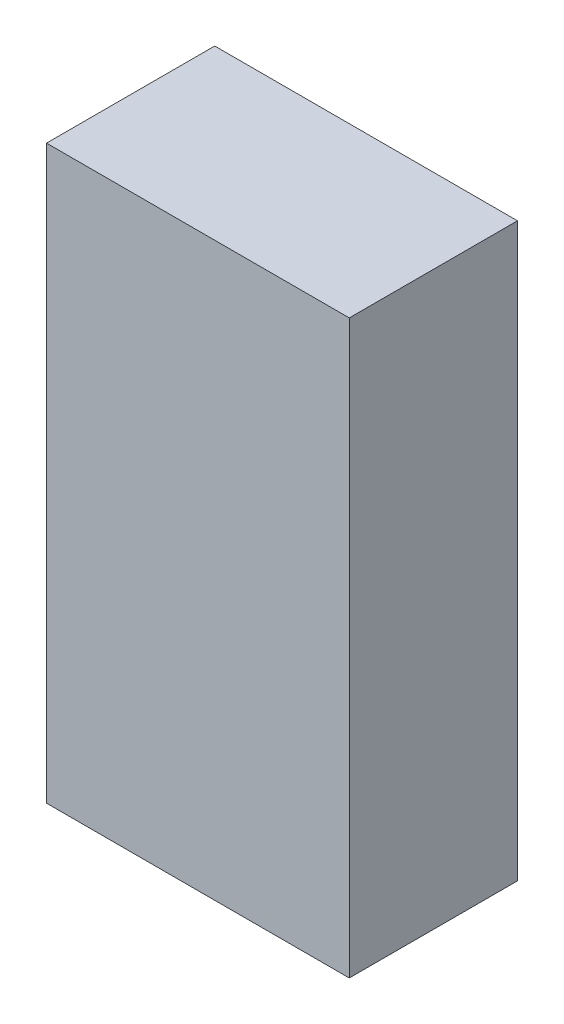
ISO-10303-21;
HEADER;
FILE_DESCRIPTION(('STEP AP214'),'2;1');
FILE_NAME('part.step','',(''),(''),'','','');
FILE_SCHEMA(('AUTOMOTIVE_DESIGN { 1 0 10303 214 1 1 1 1 }'));
ENDSEC;
DATA;
#1=APPLICATION_CONTEXT('core data for automotive mechanical design processes');
#2=APPLICATION_PROTOCOL_DEFINITION('international standard','automotive_design',2000,#1);
#3=PRODUCT_CONTEXT('',#1,'mechanical');
#4=PRODUCT('Part','Part','',(#3));
#5=PRODUCT_RELATED_PRODUCT_CATEGORY('part','',(#4));
#6=PRODUCT_DEFINITION_FORMATION('','',#4);
#7=PRODUCT_DEFINITION_CONTEXT('part definition',#1,'design');
#8=PRODUCT_DEFINITION('design','',#6,#7);
#9=PRODUCT_DEFINITION_SHAPE('','',#8);
#10=(LENGTH_UNIT() NAMED_UNIT(*) SI_UNIT(.MILLI.,.METRE.));
#11=(NAMED_UNIT(*) PLANE_ANGLE_UNIT() SI_UNIT($,.RADIAN.));
#12=(NAMED_UNIT(*) SI_UNIT($,.STERADIAN.) SOLID_ANGLE_UNIT());
#13=UNCERTAINTY_MEASURE_WITH_UNIT(LENGTH_MEASURE(1.E-05),#10,'distance_accuracy_value','');
#14=(GEOMETRIC_REPRESENTATION_CONTEXT(3) GLOBAL_UNCERTAINTY_ASSIGNED_CONTEXT((#13)) GLOBAL_UNIT_ASSIGNED_CONTEXT((#10,
#11,#12)) REPRESENTATION_CONTEXT('',''));
#15=CARTESIAN_POINT('',(0.,0.,0.));
#16=DIRECTION('',(0.,0.,1.));
#17=DIRECTION('',(1.,0.,0.));
#18=AXIS2_PLACEMENT_3D('',#15,#16,#17);
#19=CARTESIAN_POINT('',(18.2499,38.349936,0.822706));
#20=DIRECTION('',(1.,0.,0.));
#21=DIRECTION('',(0.,1.,0.));
#22=AXIS2_PLACEMENT_3D('',#19,#20,#21);
#23=PLANE('',#22);
#24=DIRECTION('',(0.,0.,1.));
#25=VECTOR('',#24,1.);
#26=CARTESIAN_POINT('',(18.2499,36.650168,0.32258));
#27=LINE('',#26,#25);
#28=CARTESIAN_POINT('',(18.2499,36.650168,0.32258));
#29=VERTEX_POINT('',#28);
#30=CARTESIAN_POINT('',(18.2499,36.650168,0.822706));
#31=VERTEX_POINT('',#30);
#32=EDGE_CURVE('E11',#29,#31,#27,.T.);
#33=ORIENTED_EDGE('',*,*,#32,.T.);
#34=DIRECTION('',(0.,1.,0.));
#35=VECTOR('',#34,1.);
#36=CARTESIAN_POINT('',(18.2499,36.650168,0.822706));
#37=LINE('',#36,#35);
#38=CARTESIAN_POINT('',(18.2499,38.349936,0.822706));
#39=VERTEX_POINT('',#38);
#40=EDGE_CURVE('E81',#31,#39,#37,.T.);
#41=ORIENTED_EDGE('',*,*,#40,.T.);
#42=DIRECTION('',(0.,0.,1.));
#43=VECTOR('',#42,1.);
#44=CARTESIAN_POINT('',(18.2499,38.349936,0.32258));
#45=LINE('',#44,#43);
#46=CARTESIAN_POINT('',(18.2499,38.349936,0.32258));
#47=VERTEX_POINT('',#46);
#48=EDGE_CURVE('E78',#47,#39,#45,.T.);
#49=ORIENTED_EDGE('',*,*,#48,.F.);
#50=DIRECTION('',(0.,-1.,0.));
#51=VECTOR('',#50,1.);
#52=CARTESIAN_POINT('',(18.2499,38.349936,0.32258));
#53=LINE('',#52,#51);
#54=EDGE_CURVE('E21',#47,#29,#53,.T.);
#55=ORIENTED_EDGE('',*,*,#54,.T.);
#56=EDGE_LOOP('',(#33,#41,#49,#55));
#57=FACE_BOUND('',#56,.T.);
#58=ADVANCED_FACE('F17',(#57),#23,.F.);
#59=CARTESIAN_POINT('',(18.2499,36.650168,0.822706));
#60=DIRECTION('',(0.,1.,0.));
#61=DIRECTION('',(1.,0.,0.));
#62=AXIS2_PLACEMENT_3D('',#59,#60,#61);
#63=PLANE('',#62);
#64=DIRECTION('',(0.,0.,-1.));
#65=VECTOR('',#64,1.);
#66=CARTESIAN_POINT('',(19.150076,36.650168,0.822706));
#67=LINE('',#66,#65);
#68=CARTESIAN_POINT('',(19.150076,36.650168,0.822706));
#69=VERTEX_POINT('',#68);
#70=CARTESIAN_POINT('',(19.150076,36.650168,0.32258));
#71=VERTEX_POINT('',#70);
#72=EDGE_CURVE('E100',#69,#71,#67,.T.);
#73=ORIENTED_EDGE('',*,*,#72,.F.);
#74=DIRECTION('',(-1.,0.,0.));
#75=VECTOR('',#74,1.);
#76=CARTESIAN_POINT('',(19.150076,36.650168,0.822706));
#77=LINE('',#76,#75);
#78=EDGE_CURVE('E28',#69,#31,#77,.T.);
#79=ORIENTED_EDGE('',*,*,#78,.T.);
#80=ORIENTED_EDGE('',*,*,#32,.F.);
#81=DIRECTION('',(1.,0.,0.));
#82=VECTOR('',#81,1.);
#83=CARTESIAN_POINT('',(18.2499,36.650168,0.32258));
#84=LINE('',#83,#82);
#85=EDGE_CURVE('E90',#29,#71,#84,.T.);
#86=ORIENTED_EDGE('',*,*,#85,.T.);
#87=EDGE_LOOP('',(#73,#79,#80,#86));
#88=FACE_BOUND('',#87,.T.);
#89=ADVANCED_FACE('F129',(#88),#63,.F.);
#90=CARTESIAN_POINT('',(0.,0.,0.822706));
#91=DIRECTION('',(0.,0.,1.));
#92=DIRECTION('',(1.,0.,0.));
#93=AXIS2_PLACEMENT_3D('',#90,#91,#92);
#94=PLANE('',#93);
#95=DIRECTION('',(1.,0.,0.));
#96=VECTOR('',#95,1.);
#97=CARTESIAN_POINT('',(18.2499,38.349936,0.822706));
#98=LINE('',#97,#96);
#99=CARTESIAN_POINT('',(19.150076,38.349936,0.822706));
#100=VERTEX_POINT('',#99);
#101=EDGE_CURVE('E58',#39,#100,#98,.T.);
#102=ORIENTED_EDGE('',*,*,#101,.F.);
#103=ORIENTED_EDGE('',*,*,#40,.F.);
#104=ORIENTED_EDGE('',*,*,#78,.F.);
#105=DIRECTION('',(0.,-1.,0.));
#106=VECTOR('',#105,1.);
#107=CARTESIAN_POINT('',(19.150076,38.349936,0.822706));
#108=LINE('',#107,#106);
#109=EDGE_CURVE('E106',#100,#69,#108,.T.);
#110=ORIENTED_EDGE('',*,*,#109,.F.);
#111=EDGE_LOOP('',(#102,#103,#104,#110));
#112=FACE_BOUND('',#111,.T.);
#113=ADVANCED_FACE('F131',(#112),#94,.T.);
#114=CARTESIAN_POINT('',(19.150076,38.349936,0.822706));
#115=DIRECTION('',(0.,-1.,0.));
#116=DIRECTION('',(0.,0.,-1.));
#117=AXIS2_PLACEMENT_3D('',#114,#115,#116);
#118=PLANE('',#117);
#119=ORIENTED_EDGE('',*,*,#48,.T.);
#120=ORIENTED_EDGE('',*,*,#101,.T.);
#121=DIRECTION('',(0.,0.,1.));
#122=VECTOR('',#121,1.);
#123=CARTESIAN_POINT('',(19.150076,38.349936,0.32258));
#124=LINE('',#123,#122);
#125=CARTESIAN_POINT('',(19.150076,38.349936,0.32258));
#126=VERTEX_POINT('',#125);
#127=EDGE_CURVE('E86',#126,#100,#124,.T.);
#128=ORIENTED_EDGE('',*,*,#127,.F.);
#129=DIRECTION('',(-1.,0.,0.));
#130=VECTOR('',#129,1.);
#131=CARTESIAN_POINT('',(19.150076,38.349936,0.32258));
#132=LINE('',#131,#130);
#133=EDGE_CURVE('E72',#126,#47,#132,.T.);
#134=ORIENTED_EDGE('',*,*,#133,.T.);
#135=EDGE_LOOP('',(#119,#120,#128,#134));
#136=FACE_BOUND('',#135,.T.);
#137=ADVANCED_FACE('F84',(#136),#118,.F.);
#138=CARTESIAN_POINT('',(0.,0.,0.32258));
#139=DIRECTION('',(0.,0.,1.));
#140=DIRECTION('',(1.,0.,0.));
#141=AXIS2_PLACEMENT_3D('',#138,#139,#140);
#142=PLANE('',#141);
#143=ORIENTED_EDGE('',*,*,#85,.F.);
#144=ORIENTED_EDGE('',*,*,#54,.F.);
#145=ORIENTED_EDGE('',*,*,#133,.F.);
#146=DIRECTION('',(0.,1.,0.));
#147=VECTOR('',#146,1.);
#148=CARTESIAN_POINT('',(19.150076,36.650168,0.32258));
#149=LINE('',#148,#147);
#150=EDGE_CURVE('E95',#71,#126,#149,.T.);
#151=ORIENTED_EDGE('',*,*,#150,.F.);
#152=EDGE_LOOP('',(#143,#144,#145,#151));
#153=FACE_BOUND('',#152,.T.);
#154=ADVANCED_FACE('F89',(#153),#142,.F.);
#155=CARTESIAN_POINT('',(19.150076,36.650168,0.822706));
#156=DIRECTION('',(-1.,0.,0.));
#157=DIRECTION('',(0.,0.,1.));
#158=AXIS2_PLACEMENT_3D('',#155,#156,#157);
#159=PLANE('',#158);
#160=ORIENTED_EDGE('',*,*,#127,.T.);
#161=ORIENTED_EDGE('',*,*,#109,.T.);
#162=ORIENTED_EDGE('',*,*,#72,.T.);
#163=ORIENTED_EDGE('',*,*,#150,.T.);
#164=EDGE_LOOP('',(#160,#161,#162,#163));
#165=FACE_BOUND('',#164,.T.);
#166=ADVANCED_FACE('F19',(#165),#159,.F.);
#167=CLOSED_SHELL('',(#58,#89,#113,#137,#154,#166));
#168=MANIFOLD_SOLID_BREP('B1',#167);
#169=ADVANCED_BREP_SHAPE_REPRESENTATION('',(#18,#168),#14);
#170=SHAPE_DEFINITION_REPRESENTATION(#9,#169);
ENDSEC;
END-ISO-10303-21;
